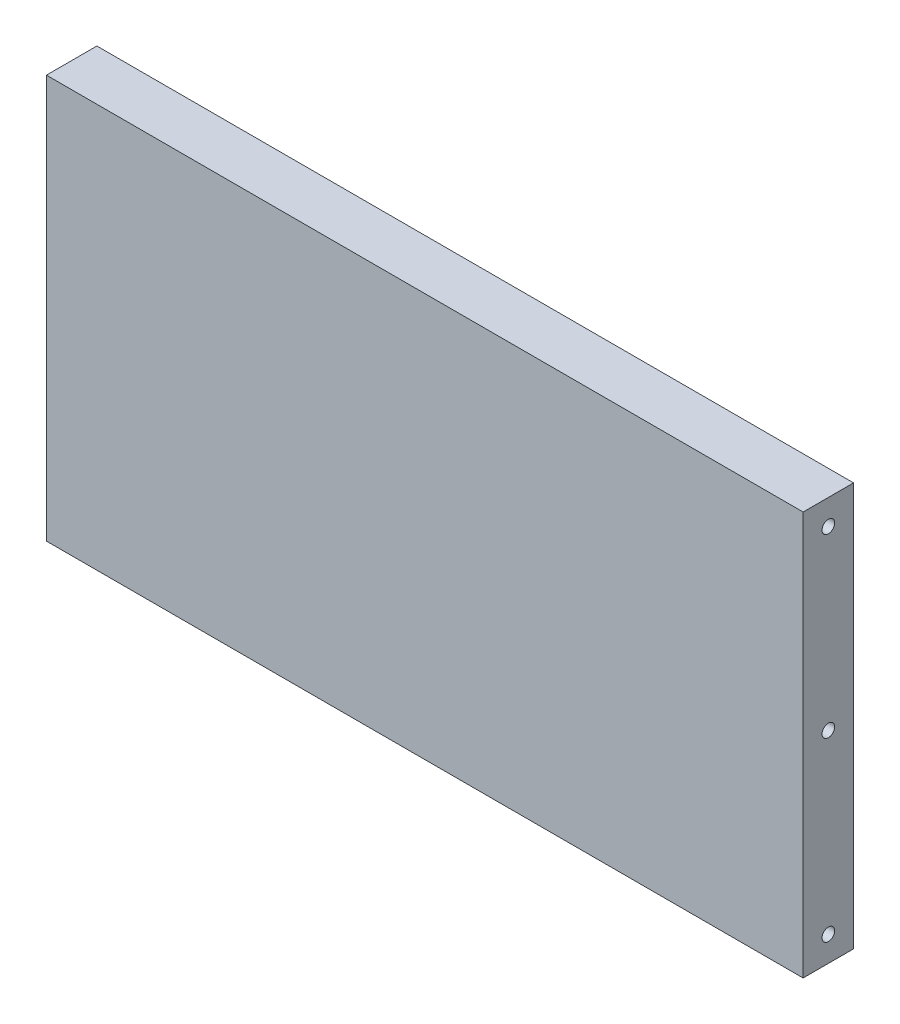
ISO-10303-21;
HEADER;
FILE_DESCRIPTION(('STEP AP214'),'2;1');
FILE_NAME('part.step','',(''),(''),'','','');
FILE_SCHEMA(('AUTOMOTIVE_DESIGN { 1 0 10303 214 1 1 1 1 }'));
ENDSEC;
DATA;
#1=APPLICATION_CONTEXT('core data for automotive mechanical design processes');
#2=APPLICATION_PROTOCOL_DEFINITION('international standard','automotive_design',2000,#1);
#3=PRODUCT_CONTEXT('',#1,'mechanical');
#4=PRODUCT('Part','Part','',(#3));
#5=PRODUCT_RELATED_PRODUCT_CATEGORY('part','',(#4));
#6=PRODUCT_DEFINITION_FORMATION('','',#4);
#7=PRODUCT_DEFINITION_CONTEXT('part definition',#1,'design');
#8=PRODUCT_DEFINITION('design','',#6,#7);
#9=PRODUCT_DEFINITION_SHAPE('','',#8);
#10=(LENGTH_UNIT() NAMED_UNIT(*) SI_UNIT(.MILLI.,.METRE.));
#11=(NAMED_UNIT(*) PLANE_ANGLE_UNIT() SI_UNIT($,.RADIAN.));
#12=(NAMED_UNIT(*) SI_UNIT($,.STERADIAN.) SOLID_ANGLE_UNIT());
#13=UNCERTAINTY_MEASURE_WITH_UNIT(LENGTH_MEASURE(1.E-05),#10,'distance_accuracy_value','');
#14=(GEOMETRIC_REPRESENTATION_CONTEXT(3) GLOBAL_UNCERTAINTY_ASSIGNED_CONTEXT((#13)) GLOBAL_UNIT_ASSIGNED_CONTEXT((#10,
#11,#12)) REPRESENTATION_CONTEXT('',''));
#15=CARTESIAN_POINT('',(0.,0.,0.));
#16=DIRECTION('',(0.,0.,1.));
#17=DIRECTION('',(1.,0.,0.));
#18=AXIS2_PLACEMENT_3D('',#15,#16,#17);
#19=CARTESIAN_POINT('',(-65.5556119857796,65.2272727272728,10.));
#20=DIRECTION('',(1.,0.,0.));
#21=DIRECTION('',(0.,1.,0.));
#22=AXIS2_PLACEMENT_3D('',#19,#20,#21);
#23=PLANE('',#22);
#24=CARTESIAN_POINT('',(-65.5556119857796,60.2272727272728,5.));
#25=DIRECTION('',(-1.,0.,0.));
#26=DIRECTION('',(0.,-1.,0.));
#27=AXIS2_PLACEMENT_3D('',#24,#25,#26);
#28=CIRCLE('',#27,1.25);
#29=CARTESIAN_POINT('',(-65.5556119857796,58.9772727272728,5.));
#30=VERTEX_POINT('',#29);
#31=EDGE_CURVE('E122',#30,#30,#28,.T.);
#32=ORIENTED_EDGE('',*,*,#31,.F.);
#33=EDGE_LOOP('',(#32));
#34=FACE_BOUND('',#33,.T.);
#35=CARTESIAN_POINT('',(-65.5556119857796,25.2272727272728,5.));
#36=DIRECTION('',(-1.,0.,0.));
#37=DIRECTION('',(0.,-1.,0.));
#38=AXIS2_PLACEMENT_3D('',#35,#36,#37);
#39=CIRCLE('',#38,1.25);
#40=CARTESIAN_POINT('',(-65.5556119857796,23.9772727272728,5.));
#41=VERTEX_POINT('',#40);
#42=EDGE_CURVE('E116',#41,#41,#39,.T.);
#43=ORIENTED_EDGE('',*,*,#42,.F.);
#44=EDGE_LOOP('',(#43));
#45=FACE_BOUND('',#44,.T.);
#46=CARTESIAN_POINT('',(-65.5556119857795,-9.77272727272724,5.00000000000001));
#47=DIRECTION('',(-1.,0.,0.));
#48=DIRECTION('',(0.,-1.,0.));
#49=AXIS2_PLACEMENT_3D('',#46,#47,#48);
#50=CIRCLE('',#49,1.25);
#51=CARTESIAN_POINT('',(-65.5556119857795,-11.0227272727272,5.00000000000001));
#52=VERTEX_POINT('',#51);
#53=EDGE_CURVE('E109',#52,#52,#50,.T.);
#54=ORIENTED_EDGE('',*,*,#53,.F.);
#55=EDGE_LOOP('',(#54));
#56=FACE_BOUND('',#55,.T.);
#57=DIRECTION('',(0.,-1.,0.));
#58=VECTOR('',#57,1.);
#59=CARTESIAN_POINT('',(-65.5556119857796,65.2272727272728,0.));
#60=LINE('',#59,#58);
#61=CARTESIAN_POINT('',(-65.5556119857796,65.2272727272728,0.));
#62=VERTEX_POINT('',#61);
#63=CARTESIAN_POINT('',(-65.5556119857795,-14.7727272727272,0.));
#64=VERTEX_POINT('',#63);
#65=EDGE_CURVE('E95',#62,#64,#60,.T.);
#66=ORIENTED_EDGE('',*,*,#65,.T.);
#67=DIRECTION('',(0.,0.,-1.));
#68=VECTOR('',#67,1.);
#69=CARTESIAN_POINT('',(-65.5556119857795,-14.7727272727272,10.));
#70=LINE('',#69,#68);
#71=CARTESIAN_POINT('',(-65.5556119857795,-14.7727272727272,10.));
#72=VERTEX_POINT('',#71);
#73=EDGE_CURVE('E11',#72,#64,#70,.T.);
#74=ORIENTED_EDGE('',*,*,#73,.F.);
#75=DIRECTION('',(0.,-1.,0.));
#76=VECTOR('',#75,1.);
#77=CARTESIAN_POINT('',(-65.5556119857796,65.2272727272728,10.));
#78=LINE('',#77,#76);
#79=CARTESIAN_POINT('',(-65.5556119857796,65.2272727272728,10.));
#80=VERTEX_POINT('',#79);
#81=EDGE_CURVE('E83',#80,#72,#78,.T.);
#82=ORIENTED_EDGE('',*,*,#81,.F.);
#83=DIRECTION('',(0.,0.,-1.));
#84=VECTOR('',#83,1.);
#85=CARTESIAN_POINT('',(-65.5556119857796,65.2272727272728,10.));
#86=LINE('',#85,#84);
#87=EDGE_CURVE('E91',#80,#62,#86,.T.);
#88=ORIENTED_EDGE('',*,*,#87,.T.);
#89=EDGE_LOOP('',(#66,#74,#82,#88));
#90=FACE_BOUND('',#89,.T.);
#91=ADVANCED_FACE('F32',(#34,#45,#56,#90),#23,.F.);
#92=CARTESIAN_POINT('',(-65.5556119857795,-14.7727272727272,10.));
#93=DIRECTION('',(0.,1.,0.));
#94=DIRECTION('',(0.,0.,1.));
#95=AXIS2_PLACEMENT_3D('',#92,#93,#94);
#96=PLANE('',#95);
#97=DIRECTION('',(1.,0.,0.));
#98=VECTOR('',#97,1.);
#99=CARTESIAN_POINT('',(-65.5556119857795,-14.7727272727272,0.));
#100=LINE('',#99,#98);
#101=CARTESIAN_POINT('',(84.4443880142204,-14.7727272727272,0.));
#102=VERTEX_POINT('',#101);
#103=EDGE_CURVE('E87',#64,#102,#100,.T.);
#104=ORIENTED_EDGE('',*,*,#103,.T.);
#105=DIRECTION('',(0.,0.,-1.));
#106=VECTOR('',#105,1.);
#107=CARTESIAN_POINT('',(84.4443880142204,-14.7727272727272,10.));
#108=LINE('',#107,#106);
#109=CARTESIAN_POINT('',(84.4443880142204,-14.7727272727272,10.));
#110=VERTEX_POINT('',#109);
#111=EDGE_CURVE('E40',#110,#102,#108,.T.);
#112=ORIENTED_EDGE('',*,*,#111,.F.);
#113=DIRECTION('',(1.,0.,0.));
#114=VECTOR('',#113,1.);
#115=CARTESIAN_POINT('',(-65.5556119857795,-14.7727272727272,10.));
#116=LINE('',#115,#114);
#117=EDGE_CURVE('E78',#72,#110,#116,.T.);
#118=ORIENTED_EDGE('',*,*,#117,.F.);
#119=ORIENTED_EDGE('',*,*,#73,.T.);
#120=EDGE_LOOP('',(#104,#112,#118,#119));
#121=FACE_BOUND('',#120,.T.);
#122=ADVANCED_FACE('F86',(#121),#96,.F.);
#123=CARTESIAN_POINT('',(84.4443880142204,65.2272727272728,10.));
#124=DIRECTION('',(-1.,0.,0.));
#125=DIRECTION('',(0.,-1.,0.));
#126=AXIS2_PLACEMENT_3D('',#123,#124,#125);
#127=PLANE('',#126);
#128=CARTESIAN_POINT('',(84.4443880142204,60.2272727272728,5.));
#129=DIRECTION('',(1.,0.,0.));
#130=DIRECTION('',(0.,1.,0.));
#131=AXIS2_PLACEMENT_3D('',#128,#129,#130);
#132=CIRCLE('',#131,1.25);
#133=CARTESIAN_POINT('',(84.4443880142204,61.4772727272728,5.));
#134=VERTEX_POINT('',#133);
#135=EDGE_CURVE('E139',#134,#134,#132,.T.);
#136=ORIENTED_EDGE('',*,*,#135,.F.);
#137=EDGE_LOOP('',(#136));
#138=FACE_BOUND('',#137,.T.);
#139=CARTESIAN_POINT('',(84.4443880142204,25.2272727272728,5.));
#140=DIRECTION('',(1.,0.,0.));
#141=DIRECTION('',(0.,1.,0.));
#142=AXIS2_PLACEMENT_3D('',#139,#140,#141);
#143=CIRCLE('',#142,1.25);
#144=CARTESIAN_POINT('',(84.4443880142204,26.4772727272728,5.));
#145=VERTEX_POINT('',#144);
#146=EDGE_CURVE('E133',#145,#145,#143,.T.);
#147=ORIENTED_EDGE('',*,*,#146,.F.);
#148=EDGE_LOOP('',(#147));
#149=FACE_BOUND('',#148,.T.);
#150=CARTESIAN_POINT('',(84.4443880142204,-9.77272727272724,4.99999999999999));
#151=DIRECTION('',(1.,0.,0.));
#152=DIRECTION('',(0.,1.,0.));
#153=AXIS2_PLACEMENT_3D('',#150,#151,#152);
#154=CIRCLE('',#153,1.25);
#155=CARTESIAN_POINT('',(84.4443880142204,-8.52272727272724,4.99999999999999));
#156=VERTEX_POINT('',#155);
#157=EDGE_CURVE('E127',#156,#156,#154,.T.);
#158=ORIENTED_EDGE('',*,*,#157,.F.);
#159=EDGE_LOOP('',(#158));
#160=FACE_BOUND('',#159,.T.);
#161=DIRECTION('',(0.,1.,0.));
#162=VECTOR('',#161,1.);
#163=CARTESIAN_POINT('',(84.4443880142204,65.2272727272728,0.));
#164=LINE('',#163,#162);
#165=CARTESIAN_POINT('',(84.4443880142204,65.2272727272728,0.));
#166=VERTEX_POINT('',#165);
#167=EDGE_CURVE('E65',#102,#166,#164,.T.);
#168=ORIENTED_EDGE('',*,*,#167,.T.);
#169=DIRECTION('',(0.,0.,-1.));
#170=VECTOR('',#169,1.);
#171=CARTESIAN_POINT('',(84.4443880142204,65.2272727272728,10.));
#172=LINE('',#171,#170);
#173=CARTESIAN_POINT('',(84.4443880142204,65.2272727272728,10.));
#174=VERTEX_POINT('',#173);
#175=EDGE_CURVE('E88',#174,#166,#172,.T.);
#176=ORIENTED_EDGE('',*,*,#175,.F.);
#177=DIRECTION('',(0.,1.,0.));
#178=VECTOR('',#177,1.);
#179=CARTESIAN_POINT('',(84.4443880142204,65.2272727272728,10.));
#180=LINE('',#179,#178);
#181=EDGE_CURVE('E81',#110,#174,#180,.T.);
#182=ORIENTED_EDGE('',*,*,#181,.F.);
#183=ORIENTED_EDGE('',*,*,#111,.T.);
#184=EDGE_LOOP('',(#168,#176,#182,#183));
#185=FACE_BOUND('',#184,.T.);
#186=ADVANCED_FACE('F89',(#138,#149,#160,#185),#127,.F.);
#187=CARTESIAN_POINT('',(-65.5556119857796,65.2272727272728,10.));
#188=DIRECTION('',(0.,-1.,0.));
#189=DIRECTION('',(0.,0.,-1.));
#190=AXIS2_PLACEMENT_3D('',#187,#188,#189);
#191=PLANE('',#190);
#192=DIRECTION('',(-1.,0.,0.));
#193=VECTOR('',#192,1.);
#194=CARTESIAN_POINT('',(-65.5556119857796,65.2272727272728,0.));
#195=LINE('',#194,#193);
#196=EDGE_CURVE('E71',#166,#62,#195,.T.);
#197=ORIENTED_EDGE('',*,*,#196,.T.);
#198=ORIENTED_EDGE('',*,*,#87,.F.);
#199=DIRECTION('',(-1.,0.,0.));
#200=VECTOR('',#199,1.);
#201=CARTESIAN_POINT('',(-65.5556119857796,65.2272727272728,10.));
#202=LINE('',#201,#200);
#203=EDGE_CURVE('E48',#174,#80,#202,.T.);
#204=ORIENTED_EDGE('',*,*,#203,.F.);
#205=ORIENTED_EDGE('',*,*,#175,.T.);
#206=EDGE_LOOP('',(#197,#198,#204,#205));
#207=FACE_BOUND('',#206,.T.);
#208=ADVANCED_FACE('F103',(#207),#191,.F.);
#209=CARTESIAN_POINT('',(0.,0.,10.));
#210=DIRECTION('',(0.,0.,1.));
#211=DIRECTION('',(1.,0.,0.));
#212=AXIS2_PLACEMENT_3D('',#209,#210,#211);
#213=PLANE('',#212);
#214=ORIENTED_EDGE('',*,*,#81,.T.);
#215=ORIENTED_EDGE('',*,*,#117,.T.);
#216=ORIENTED_EDGE('',*,*,#181,.T.);
#217=ORIENTED_EDGE('',*,*,#203,.T.);
#218=EDGE_LOOP('',(#214,#215,#216,#217));
#219=FACE_BOUND('',#218,.T.);
#220=ADVANCED_FACE('F79',(#219),#213,.T.);
#221=CARTESIAN_POINT('',(0.,0.,0.));
#222=DIRECTION('',(0.,0.,1.));
#223=DIRECTION('',(1.,0.,0.));
#224=AXIS2_PLACEMENT_3D('',#221,#222,#223);
#225=PLANE('',#224);
#226=ORIENTED_EDGE('',*,*,#65,.F.);
#227=ORIENTED_EDGE('',*,*,#196,.F.);
#228=ORIENTED_EDGE('',*,*,#167,.F.);
#229=ORIENTED_EDGE('',*,*,#103,.F.);
#230=EDGE_LOOP('',(#226,#227,#228,#229));
#231=FACE_BOUND('',#230,.T.);
#232=ADVANCED_FACE('F106',(#231),#225,.F.);
#233=CARTESIAN_POINT('',(-60.5556119857796,-9.77272727272724,5.00000000000001));
#234=DIRECTION('',(-1.,0.,0.));
#235=DIRECTION('',(0.,-1.,0.));
#236=AXIS2_PLACEMENT_3D('',#233,#234,#235);
#237=CYLINDRICAL_SURFACE('',#236,1.25);
#238=CARTESIAN_POINT('',(-60.5556119857796,-9.77272727272724,5.00000000000001));
#239=DIRECTION('',(-1.,0.,0.));
#240=DIRECTION('',(0.,-1.,0.));
#241=AXIS2_PLACEMENT_3D('',#238,#239,#240);
#242=CIRCLE('',#241,1.25);
#243=CARTESIAN_POINT('',(-60.5556119857796,-11.0227272727272,5.00000000000001));
#244=VERTEX_POINT('',#243);
#245=EDGE_CURVE('E112',#244,#244,#242,.T.);
#246=ORIENTED_EDGE('',*,*,#245,.F.);
#247=EDGE_LOOP('',(#246));
#248=FACE_BOUND('',#247,.T.);
#249=ORIENTED_EDGE('',*,*,#53,.T.);
#250=EDGE_LOOP('',(#249));
#251=FACE_BOUND('',#250,.T.);
#252=ADVANCED_FACE('F189',(#248,#251),#237,.F.);
#253=CARTESIAN_POINT('',(-60.5556119857796,-9.77272727272724,5.00000000000001));
#254=DIRECTION('',(-1.,0.,0.));
#255=DIRECTION('',(0.,-1.,0.));
#256=AXIS2_PLACEMENT_3D('',#253,#254,#255);
#257=PLANE('',#256);
#258=ORIENTED_EDGE('',*,*,#245,.T.);
#259=EDGE_LOOP('',(#258));
#260=FACE_BOUND('',#259,.T.);
#261=ADVANCED_FACE('F191',(#260),#257,.T.);
#262=CARTESIAN_POINT('',(-60.5556119857796,25.2272727272728,5.));
#263=DIRECTION('',(-1.,0.,0.));
#264=DIRECTION('',(0.,-1.,0.));
#265=AXIS2_PLACEMENT_3D('',#262,#263,#264);
#266=CYLINDRICAL_SURFACE('',#265,1.25);
#267=CARTESIAN_POINT('',(-60.5556119857796,25.2272727272728,5.));
#268=DIRECTION('',(-1.,0.,0.));
#269=DIRECTION('',(0.,-1.,0.));
#270=AXIS2_PLACEMENT_3D('',#267,#268,#269);
#271=CIRCLE('',#270,1.25);
#272=CARTESIAN_POINT('',(-60.5556119857796,23.9772727272728,5.));
#273=VERTEX_POINT('',#272);
#274=EDGE_CURVE('E119',#273,#273,#271,.T.);
#275=ORIENTED_EDGE('',*,*,#274,.F.);
#276=EDGE_LOOP('',(#275));
#277=FACE_BOUND('',#276,.T.);
#278=ORIENTED_EDGE('',*,*,#42,.T.);
#279=EDGE_LOOP('',(#278));
#280=FACE_BOUND('',#279,.T.);
#281=ADVANCED_FACE('F198',(#277,#280),#266,.F.);
#282=CARTESIAN_POINT('',(-60.5556119857796,25.2272727272728,5.));
#283=DIRECTION('',(-1.,0.,0.));
#284=DIRECTION('',(0.,-1.,0.));
#285=AXIS2_PLACEMENT_3D('',#282,#283,#284);
#286=PLANE('',#285);
#287=ORIENTED_EDGE('',*,*,#274,.T.);
#288=EDGE_LOOP('',(#287));
#289=FACE_BOUND('',#288,.T.);
#290=ADVANCED_FACE('F245',(#289),#286,.T.);
#291=CARTESIAN_POINT('',(-60.5556119857796,60.2272727272728,5.));
#292=DIRECTION('',(-1.,0.,0.));
#293=DIRECTION('',(0.,-1.,0.));
#294=AXIS2_PLACEMENT_3D('',#291,#292,#293);
#295=CYLINDRICAL_SURFACE('',#294,1.25);
#296=CARTESIAN_POINT('',(-60.5556119857796,60.2272727272728,5.));
#297=DIRECTION('',(-1.,0.,0.));
#298=DIRECTION('',(0.,-1.,0.));
#299=AXIS2_PLACEMENT_3D('',#296,#297,#298);
#300=CIRCLE('',#299,1.25);
#301=CARTESIAN_POINT('',(-60.5556119857796,58.9772727272728,5.));
#302=VERTEX_POINT('',#301);
#303=EDGE_CURVE('E98',#302,#302,#300,.T.);
#304=ORIENTED_EDGE('',*,*,#303,.F.);
#305=EDGE_LOOP('',(#304));
#306=FACE_BOUND('',#305,.T.);
#307=ORIENTED_EDGE('',*,*,#31,.T.);
#308=EDGE_LOOP('',(#307));
#309=FACE_BOUND('',#308,.T.);
#310=ADVANCED_FACE('F174',(#306,#309),#295,.F.);
#311=CARTESIAN_POINT('',(-60.5556119857796,60.2272727272728,5.));
#312=DIRECTION('',(-1.,0.,0.));
#313=DIRECTION('',(0.,-1.,0.));
#314=AXIS2_PLACEMENT_3D('',#311,#312,#313);
#315=PLANE('',#314);
#316=ORIENTED_EDGE('',*,*,#303,.T.);
#317=EDGE_LOOP('',(#316));
#318=FACE_BOUND('',#317,.T.);
#319=ADVANCED_FACE('F164',(#318),#315,.T.);
#320=CARTESIAN_POINT('',(79.4443880142204,-9.77272727272724,4.99999999999999));
#321=DIRECTION('',(1.,0.,0.));
#322=DIRECTION('',(0.,1.,0.));
#323=AXIS2_PLACEMENT_3D('',#320,#321,#322);
#324=CYLINDRICAL_SURFACE('',#323,1.25);
#325=CARTESIAN_POINT('',(79.4443880142204,-9.77272727272724,4.99999999999999));
#326=DIRECTION('',(1.,0.,0.));
#327=DIRECTION('',(0.,1.,0.));
#328=AXIS2_PLACEMENT_3D('',#325,#326,#327);
#329=CIRCLE('',#328,1.25);
#330=CARTESIAN_POINT('',(79.4443880142204,-8.52272727272724,4.99999999999999));
#331=VERTEX_POINT('',#330);
#332=EDGE_CURVE('E130',#331,#331,#329,.T.);
#333=ORIENTED_EDGE('',*,*,#332,.F.);
#334=EDGE_LOOP('',(#333));
#335=FACE_BOUND('',#334,.T.);
#336=ORIENTED_EDGE('',*,*,#157,.T.);
#337=EDGE_LOOP('',(#336));
#338=FACE_BOUND('',#337,.T.);
#339=ADVANCED_FACE('F161',(#335,#338),#324,.F.);
#340=CARTESIAN_POINT('',(79.4443880142204,-9.77272727272724,4.99999999999999));
#341=DIRECTION('',(1.,0.,0.));
#342=DIRECTION('',(0.,1.,0.));
#343=AXIS2_PLACEMENT_3D('',#340,#341,#342);
#344=PLANE('',#343);
#345=ORIENTED_EDGE('',*,*,#332,.T.);
#346=EDGE_LOOP('',(#345));
#347=FACE_BOUND('',#346,.T.);
#348=ADVANCED_FACE('F163',(#347),#344,.T.);
#349=CARTESIAN_POINT('',(79.4443880142204,25.2272727272728,5.));
#350=DIRECTION('',(1.,0.,0.));
#351=DIRECTION('',(0.,1.,0.));
#352=AXIS2_PLACEMENT_3D('',#349,#350,#351);
#353=CYLINDRICAL_SURFACE('',#352,1.25);
#354=CARTESIAN_POINT('',(79.4443880142204,25.2272727272728,5.));
#355=DIRECTION('',(1.,0.,0.));
#356=DIRECTION('',(0.,1.,0.));
#357=AXIS2_PLACEMENT_3D('',#354,#355,#356);
#358=CIRCLE('',#357,1.25);
#359=CARTESIAN_POINT('',(79.4443880142204,26.4772727272728,5.));
#360=VERTEX_POINT('',#359);
#361=EDGE_CURVE('E136',#360,#360,#358,.T.);
#362=ORIENTED_EDGE('',*,*,#361,.F.);
#363=EDGE_LOOP('',(#362));
#364=FACE_BOUND('',#363,.T.);
#365=ORIENTED_EDGE('',*,*,#146,.T.);
#366=EDGE_LOOP('',(#365));
#367=FACE_BOUND('',#366,.T.);
#368=ADVANCED_FACE('F171',(#364,#367),#353,.F.);
#369=CARTESIAN_POINT('',(79.4443880142204,25.2272727272728,5.));
#370=DIRECTION('',(1.,0.,0.));
#371=DIRECTION('',(0.,1.,0.));
#372=AXIS2_PLACEMENT_3D('',#369,#370,#371);
#373=PLANE('',#372);
#374=ORIENTED_EDGE('',*,*,#361,.T.);
#375=EDGE_LOOP('',(#374));
#376=FACE_BOUND('',#375,.T.);
#377=ADVANCED_FACE('F150',(#376),#373,.T.);
#378=CARTESIAN_POINT('',(79.4443880142204,60.2272727272728,5.));
#379=DIRECTION('',(1.,0.,0.));
#380=DIRECTION('',(0.,1.,0.));
#381=AXIS2_PLACEMENT_3D('',#378,#379,#380);
#382=CYLINDRICAL_SURFACE('',#381,1.25);
#383=CARTESIAN_POINT('',(79.4443880142204,60.2272727272728,5.));
#384=DIRECTION('',(1.,0.,0.));
#385=DIRECTION('',(0.,1.,0.));
#386=AXIS2_PLACEMENT_3D('',#383,#384,#385);
#387=CIRCLE('',#386,1.25);
#388=CARTESIAN_POINT('',(79.4443880142204,61.4772727272728,5.));
#389=VERTEX_POINT('',#388);
#390=EDGE_CURVE('E113',#389,#389,#387,.T.);
#391=ORIENTED_EDGE('',*,*,#390,.F.);
#392=EDGE_LOOP('',(#391));
#393=FACE_BOUND('',#392,.T.);
#394=ORIENTED_EDGE('',*,*,#135,.T.);
#395=EDGE_LOOP('',(#394));
#396=FACE_BOUND('',#395,.T.);
#397=ADVANCED_FACE('F147',(#393,#396),#382,.F.);
#398=CARTESIAN_POINT('',(79.4443880142204,60.2272727272728,5.));
#399=DIRECTION('',(1.,0.,0.));
#400=DIRECTION('',(0.,1.,0.));
#401=AXIS2_PLACEMENT_3D('',#398,#399,#400);
#402=PLANE('',#401);
#403=ORIENTED_EDGE('',*,*,#390,.T.);
#404=EDGE_LOOP('',(#403));
#405=FACE_BOUND('',#404,.T.);
#406=ADVANCED_FACE('F145',(#405),#402,.T.);
#407=CLOSED_SHELL('',(#91,#122,#186,#208,#220,#232,#252,#261,#281,#290,#310,#319,#339,#348,#368,
#377,#397,#406));
#408=MANIFOLD_SOLID_BREP('B2',#407);
#409=ADVANCED_BREP_SHAPE_REPRESENTATION('',(#18,#408),#14);
#410=SHAPE_DEFINITION_REPRESENTATION(#9,#409);
ENDSEC;
END-ISO-10303-21;
